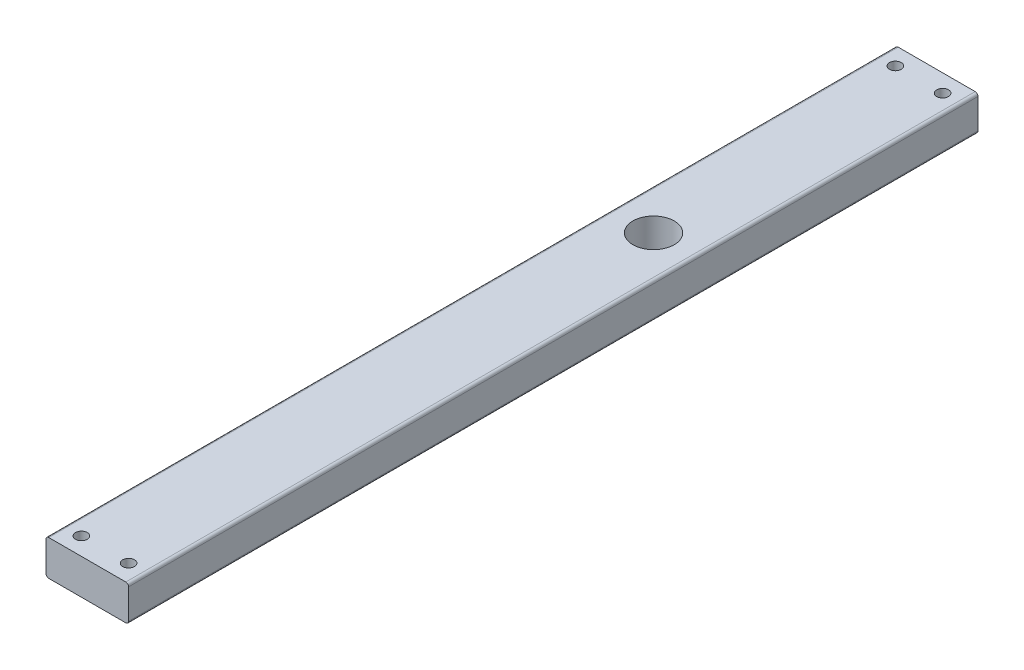
ISO-10303-21;
HEADER;
FILE_DESCRIPTION(('STEP AP214'),'2;1');
FILE_NAME('part.step','',(''),(''),'','','');
FILE_SCHEMA(('AUTOMOTIVE_DESIGN { 1 0 10303 214 1 1 1 1 }'));
ENDSEC;
DATA;
#1=APPLICATION_CONTEXT('core data for automotive mechanical design processes');
#2=APPLICATION_PROTOCOL_DEFINITION('international standard','automotive_design',2000,#1);
#3=PRODUCT_CONTEXT('',#1,'mechanical');
#4=PRODUCT('Part','Part','',(#3));
#5=PRODUCT_RELATED_PRODUCT_CATEGORY('part','',(#4));
#6=PRODUCT_DEFINITION_FORMATION('','',#4);
#7=PRODUCT_DEFINITION_CONTEXT('part definition',#1,'design');
#8=PRODUCT_DEFINITION('design','',#6,#7);
#9=PRODUCT_DEFINITION_SHAPE('','',#8);
#10=(LENGTH_UNIT() NAMED_UNIT(*) SI_UNIT(.MILLI.,.METRE.));
#11=(NAMED_UNIT(*) PLANE_ANGLE_UNIT() SI_UNIT($,.RADIAN.));
#12=(NAMED_UNIT(*) SI_UNIT($,.STERADIAN.) SOLID_ANGLE_UNIT());
#13=UNCERTAINTY_MEASURE_WITH_UNIT(LENGTH_MEASURE(1.E-05),#10,'distance_accuracy_value','');
#14=(GEOMETRIC_REPRESENTATION_CONTEXT(3) GLOBAL_UNCERTAINTY_ASSIGNED_CONTEXT((#13)) GLOBAL_UNIT_ASSIGNED_CONTEXT((#10,
#11,#12)) REPRESENTATION_CONTEXT('',''));
#15=CARTESIAN_POINT('',(0.,0.,0.));
#16=DIRECTION('',(0.,0.,1.));
#17=DIRECTION('',(1.,0.,0.));
#18=AXIS2_PLACEMENT_3D('',#15,#16,#17);
#19=CARTESIAN_POINT('',(41.45,19.05,914.4));
#20=DIRECTION('',(0.,-1.,0.));
#21=DIRECTION('',(1.,0.,0.));
#22=AXIS2_PLACEMENT_3D('',#19,#20,#21);
#23=PLANE('',#22);
#24=CARTESIAN_POINT('',(-25.4000000000001,19.05,895.35));
#25=DIRECTION('',(0.,1.,0.));
#26=DIRECTION('',(0.,0.,1.));
#27=AXIS2_PLACEMENT_3D('',#24,#25,#26);
#28=CIRCLE('',#27,6.35);
#29=CARTESIAN_POINT('',(-25.4000000000001,19.05,901.7));
#30=VERTEX_POINT('',#29);
#31=EDGE_CURVE('E248',#30,#30,#28,.T.);
#32=ORIENTED_EDGE('',*,*,#31,.F.);
#33=EDGE_LOOP('',(#32));
#34=FACE_BOUND('',#33,.T.);
#35=CARTESIAN_POINT('',(25.4000000000001,19.05,895.35));
#36=DIRECTION('',(0.,1.,0.));
#37=DIRECTION('',(0.,0.,1.));
#38=AXIS2_PLACEMENT_3D('',#35,#36,#37);
#39=CIRCLE('',#38,6.35);
#40=CARTESIAN_POINT('',(25.4000000000001,19.05,901.7));
#41=VERTEX_POINT('',#40);
#42=EDGE_CURVE('E240',#41,#41,#39,.T.);
#43=ORIENTED_EDGE('',*,*,#42,.F.);
#44=EDGE_LOOP('',(#43));
#45=FACE_BOUND('',#44,.T.);
#46=CARTESIAN_POINT('',(-25.4,19.05,19.05));
#47=DIRECTION('',(0.,1.,0.));
#48=DIRECTION('',(0.,0.,1.));
#49=AXIS2_PLACEMENT_3D('',#46,#47,#48);
#50=CIRCLE('',#49,6.35);
#51=CARTESIAN_POINT('',(-25.4,19.05,25.4));
#52=VERTEX_POINT('',#51);
#53=EDGE_CURVE('E232',#52,#52,#50,.T.);
#54=ORIENTED_EDGE('',*,*,#53,.F.);
#55=EDGE_LOOP('',(#54));
#56=FACE_BOUND('',#55,.T.);
#57=CARTESIAN_POINT('',(0.,19.05,304.8));
#58=DIRECTION('',(0.,1.,0.));
#59=DIRECTION('',(-1.,0.,0.));
#60=AXIS2_PLACEMENT_3D('',#57,#58,#59);
#61=CIRCLE('',#60,22.225);
#62=CARTESIAN_POINT('',(-22.225,19.05,304.8));
#63=VERTEX_POINT('',#62);
#64=EDGE_CURVE('E213',#63,#63,#61,.T.);
#65=ORIENTED_EDGE('',*,*,#64,.F.);
#66=EDGE_LOOP('',(#65));
#67=FACE_BOUND('',#66,.T.);
#68=DIRECTION('',(-1.,0.,0.));
#69=VECTOR('',#68,1.);
#70=CARTESIAN_POINT('',(41.45,19.05,0.));
#71=LINE('',#70,#69);
#72=CARTESIAN_POINT('',(41.45,19.05,0.));
#73=VERTEX_POINT('',#72);
#74=CARTESIAN_POINT('',(-41.45,19.05,0.));
#75=VERTEX_POINT('',#74);
#76=EDGE_CURVE('E133',#73,#75,#71,.T.);
#77=ORIENTED_EDGE('',*,*,#76,.T.);
#78=DIRECTION('',(0.,0.,-1.));
#79=VECTOR('',#78,1.);
#80=CARTESIAN_POINT('',(-41.45,19.05,914.4));
#81=LINE('',#80,#79);
#82=CARTESIAN_POINT('',(-41.45,19.05,914.4));
#83=VERTEX_POINT('',#82);
#84=EDGE_CURVE('E130',#83,#75,#81,.T.);
#85=ORIENTED_EDGE('',*,*,#84,.F.);
#86=DIRECTION('',(-1.,0.,0.));
#87=VECTOR('',#86,1.);
#88=CARTESIAN_POINT('',(41.45,19.05,914.4));
#89=LINE('',#88,#87);
#90=CARTESIAN_POINT('',(41.45,19.05,914.4));
#91=VERTEX_POINT('',#90);
#92=EDGE_CURVE('E118',#91,#83,#89,.T.);
#93=ORIENTED_EDGE('',*,*,#92,.F.);
#94=DIRECTION('',(0.,0.,-1.));
#95=VECTOR('',#94,1.);
#96=CARTESIAN_POINT('',(41.45,19.05,914.4));
#97=LINE('',#96,#95);
#98=EDGE_CURVE('E135',#91,#73,#97,.T.);
#99=ORIENTED_EDGE('',*,*,#98,.T.);
#100=EDGE_LOOP('',(#77,#85,#93,#99));
#101=FACE_BOUND('',#100,.T.);
#102=CARTESIAN_POINT('',(25.4,19.05,19.05));
#103=DIRECTION('',(0.,1.,0.));
#104=DIRECTION('',(0.,0.,1.));
#105=AXIS2_PLACEMENT_3D('',#102,#103,#104);
#106=CIRCLE('',#105,6.35);
#107=CARTESIAN_POINT('',(25.4,19.05,25.4));
#108=VERTEX_POINT('',#107);
#109=EDGE_CURVE('E224',#108,#108,#106,.T.);
#110=ORIENTED_EDGE('',*,*,#109,.F.);
#111=EDGE_LOOP('',(#110));
#112=FACE_BOUND('',#111,.T.);
#113=ADVANCED_FACE('F44',(#34,#45,#56,#67,#101,#112),#23,.F.);
#114=CARTESIAN_POINT('',(-41.45,-16.05,914.4));
#115=DIRECTION('',(0.,0.,-1.));
#116=DIRECTION('',(-1.,0.,0.));
#117=AXIS2_PLACEMENT_3D('',#114,#115,#116);
#118=CYLINDRICAL_SURFACE('',#117,3.);
#119=CARTESIAN_POINT('',(-41.45,-16.05,0.));
#120=DIRECTION('',(0.,0.,1.));
#121=DIRECTION('',(-1.,0.,0.));
#122=AXIS2_PLACEMENT_3D('',#119,#120,#121);
#123=CIRCLE('',#122,3.);
#124=CARTESIAN_POINT('',(-44.45,-16.05,0.));
#125=VERTEX_POINT('',#124);
#126=CARTESIAN_POINT('',(-41.45,-19.05,0.));
#127=VERTEX_POINT('',#126);
#128=EDGE_CURVE('E146',#125,#127,#123,.T.);
#129=ORIENTED_EDGE('',*,*,#128,.T.);
#130=DIRECTION('',(0.,0.,-1.));
#131=VECTOR('',#130,1.);
#132=CARTESIAN_POINT('',(-41.45,-19.05,914.4));
#133=LINE('',#132,#131);
#134=CARTESIAN_POINT('',(-41.45,-19.05,914.4));
#135=VERTEX_POINT('',#134);
#136=EDGE_CURVE('E11',#135,#127,#133,.T.);
#137=ORIENTED_EDGE('',*,*,#136,.F.);
#138=CARTESIAN_POINT('',(-41.45,-16.05,914.4));
#139=DIRECTION('',(0.,0.,1.));
#140=DIRECTION('',(-1.,0.,0.));
#141=AXIS2_PLACEMENT_3D('',#138,#139,#140);
#142=CIRCLE('',#141,3.);
#143=CARTESIAN_POINT('',(-44.45,-16.05,914.4));
#144=VERTEX_POINT('',#143);
#145=EDGE_CURVE('E169',#144,#135,#142,.T.);
#146=ORIENTED_EDGE('',*,*,#145,.F.);
#147=DIRECTION('',(0.,0.,-1.));
#148=VECTOR('',#147,1.);
#149=CARTESIAN_POINT('',(-44.45,-16.05,914.4));
#150=LINE('',#149,#148);
#151=EDGE_CURVE('E142',#144,#125,#150,.T.);
#152=ORIENTED_EDGE('',*,*,#151,.T.);
#153=EDGE_LOOP('',(#129,#137,#146,#152));
#154=FACE_BOUND('',#153,.T.);
#155=ADVANCED_FACE('F46',(#154),#118,.T.);
#156=CARTESIAN_POINT('',(41.45,-19.05,914.4));
#157=DIRECTION('',(0.,1.,0.));
#158=DIRECTION('',(-1.,0.,0.));
#159=AXIS2_PLACEMENT_3D('',#156,#157,#158);
#160=PLANE('',#159);
#161=CARTESIAN_POINT('',(-25.4000000000001,-19.05,895.35));
#162=DIRECTION('',(0.,1.,0.));
#163=DIRECTION('',(0.,0.,1.));
#164=AXIS2_PLACEMENT_3D('',#161,#162,#163);
#165=CIRCLE('',#164,6.34999999999999);
#166=CARTESIAN_POINT('',(-25.4000000000001,-19.05,901.7));
#167=VERTEX_POINT('',#166);
#168=EDGE_CURVE('E244',#167,#167,#165,.T.);
#169=ORIENTED_EDGE('',*,*,#168,.T.);
#170=EDGE_LOOP('',(#169));
#171=FACE_BOUND('',#170,.T.);
#172=CARTESIAN_POINT('',(25.4000000000001,-19.05,895.35));
#173=DIRECTION('',(0.,1.,0.));
#174=DIRECTION('',(0.,0.,1.));
#175=AXIS2_PLACEMENT_3D('',#172,#173,#174);
#176=CIRCLE('',#175,6.35);
#177=CARTESIAN_POINT('',(25.4000000000001,-19.05,901.7));
#178=VERTEX_POINT('',#177);
#179=EDGE_CURVE('E236',#178,#178,#176,.T.);
#180=ORIENTED_EDGE('',*,*,#179,.T.);
#181=EDGE_LOOP('',(#180));
#182=FACE_BOUND('',#181,.T.);
#183=CARTESIAN_POINT('',(-25.4,-19.05,19.05));
#184=DIRECTION('',(0.,1.,0.));
#185=DIRECTION('',(0.,0.,1.));
#186=AXIS2_PLACEMENT_3D('',#183,#184,#185);
#187=CIRCLE('',#186,6.34999999999999);
#188=CARTESIAN_POINT('',(-25.4,-19.05,25.4));
#189=VERTEX_POINT('',#188);
#190=EDGE_CURVE('E228',#189,#189,#187,.T.);
#191=ORIENTED_EDGE('',*,*,#190,.T.);
#192=EDGE_LOOP('',(#191));
#193=FACE_BOUND('',#192,.T.);
#194=CARTESIAN_POINT('',(25.4,-19.05,19.05));
#195=DIRECTION('',(0.,1.,0.));
#196=DIRECTION('',(0.,0.,1.));
#197=AXIS2_PLACEMENT_3D('',#194,#195,#196);
#198=CIRCLE('',#197,6.35);
#199=CARTESIAN_POINT('',(25.4,-19.05,25.4));
#200=VERTEX_POINT('',#199);
#201=EDGE_CURVE('E217',#200,#200,#198,.T.);
#202=ORIENTED_EDGE('',*,*,#201,.T.);
#203=EDGE_LOOP('',(#202));
#204=FACE_BOUND('',#203,.T.);
#205=CARTESIAN_POINT('',(0.,-19.05,304.8));
#206=DIRECTION('',(0.,1.,0.));
#207=DIRECTION('',(-1.,0.,0.));
#208=AXIS2_PLACEMENT_3D('',#205,#206,#207);
#209=CIRCLE('',#208,22.225);
#210=CARTESIAN_POINT('',(-22.225,-19.05,304.8));
#211=VERTEX_POINT('',#210);
#212=EDGE_CURVE('E151',#211,#211,#209,.T.);
#213=ORIENTED_EDGE('',*,*,#212,.T.);
#214=EDGE_LOOP('',(#213));
#215=FACE_BOUND('',#214,.T.);
#216=DIRECTION('',(1.,0.,0.));
#217=VECTOR('',#216,1.);
#218=CARTESIAN_POINT('',(41.45,-19.05,0.));
#219=LINE('',#218,#217);
#220=CARTESIAN_POINT('',(41.45,-19.05,0.));
#221=VERTEX_POINT('',#220);
#222=EDGE_CURVE('E150',#127,#221,#219,.T.);
#223=ORIENTED_EDGE('',*,*,#222,.T.);
#224=DIRECTION('',(0.,0.,-1.));
#225=VECTOR('',#224,1.);
#226=CARTESIAN_POINT('',(41.45,-19.05,914.4));
#227=LINE('',#226,#225);
#228=CARTESIAN_POINT('',(41.45,-19.05,914.4));
#229=VERTEX_POINT('',#228);
#230=EDGE_CURVE('E54',#229,#221,#227,.T.);
#231=ORIENTED_EDGE('',*,*,#230,.F.);
#232=DIRECTION('',(1.,0.,0.));
#233=VECTOR('',#232,1.);
#234=CARTESIAN_POINT('',(41.45,-19.05,914.4));
#235=LINE('',#234,#233);
#236=EDGE_CURVE('E105',#135,#229,#235,.T.);
#237=ORIENTED_EDGE('',*,*,#236,.F.);
#238=ORIENTED_EDGE('',*,*,#136,.T.);
#239=EDGE_LOOP('',(#223,#231,#237,#238));
#240=FACE_BOUND('',#239,.T.);
#241=ADVANCED_FACE('F292',(#171,#182,#193,#204,#215,#240),#160,.F.);
#242=CARTESIAN_POINT('',(41.45,-16.05,914.4));
#243=DIRECTION('',(0.,0.,-1.));
#244=DIRECTION('',(-1.,0.,0.));
#245=AXIS2_PLACEMENT_3D('',#242,#243,#244);
#246=CYLINDRICAL_SURFACE('',#245,3.);
#247=CARTESIAN_POINT('',(41.45,-16.05,0.));
#248=DIRECTION('',(0.,0.,1.));
#249=DIRECTION('',(1.,0.,0.));
#250=AXIS2_PLACEMENT_3D('',#247,#248,#249);
#251=CIRCLE('',#250,3.);
#252=CARTESIAN_POINT('',(44.45,-16.05,0.));
#253=VERTEX_POINT('',#252);
#254=EDGE_CURVE('E154',#221,#253,#251,.T.);
#255=ORIENTED_EDGE('',*,*,#254,.T.);
#256=DIRECTION('',(0.,0.,-1.));
#257=VECTOR('',#256,1.);
#258=CARTESIAN_POINT('',(44.45,-16.05,914.4));
#259=LINE('',#258,#257);
#260=CARTESIAN_POINT('',(44.45,-16.05,914.4));
#261=VERTEX_POINT('',#260);
#262=EDGE_CURVE('E180',#261,#253,#259,.T.);
#263=ORIENTED_EDGE('',*,*,#262,.F.);
#264=CARTESIAN_POINT('',(41.45,-16.05,914.4));
#265=DIRECTION('',(0.,0.,1.));
#266=DIRECTION('',(1.,0.,0.));
#267=AXIS2_PLACEMENT_3D('',#264,#265,#266);
#268=CIRCLE('',#267,3.);
#269=EDGE_CURVE('E190',#229,#261,#268,.T.);
#270=ORIENTED_EDGE('',*,*,#269,.F.);
#271=ORIENTED_EDGE('',*,*,#230,.T.);
#272=EDGE_LOOP('',(#255,#263,#270,#271));
#273=FACE_BOUND('',#272,.T.);
#274=ADVANCED_FACE('F188',(#273),#246,.T.);
#275=CARTESIAN_POINT('',(44.45,-16.05,914.4));
#276=DIRECTION('',(-1.,0.,0.));
#277=DIRECTION('',(0.,0.,1.));
#278=AXIS2_PLACEMENT_3D('',#275,#276,#277);
#279=PLANE('',#278);
#280=DIRECTION('',(0.,1.,0.));
#281=VECTOR('',#280,1.);
#282=CARTESIAN_POINT('',(44.45,-16.05,0.));
#283=LINE('',#282,#281);
#284=CARTESIAN_POINT('',(44.45,16.05,0.));
#285=VERTEX_POINT('',#284);
#286=EDGE_CURVE('E157',#253,#285,#283,.T.);
#287=ORIENTED_EDGE('',*,*,#286,.T.);
#288=DIRECTION('',(0.,0.,-1.));
#289=VECTOR('',#288,1.);
#290=CARTESIAN_POINT('',(44.45,16.05,914.4));
#291=LINE('',#290,#289);
#292=CARTESIAN_POINT('',(44.45,16.05,914.4));
#293=VERTEX_POINT('',#292);
#294=EDGE_CURVE('E176',#293,#285,#291,.T.);
#295=ORIENTED_EDGE('',*,*,#294,.F.);
#296=DIRECTION('',(0.,1.,0.));
#297=VECTOR('',#296,1.);
#298=CARTESIAN_POINT('',(44.45,-16.05,914.4));
#299=LINE('',#298,#297);
#300=EDGE_CURVE('E203',#261,#293,#299,.T.);
#301=ORIENTED_EDGE('',*,*,#300,.F.);
#302=ORIENTED_EDGE('',*,*,#262,.T.);
#303=EDGE_LOOP('',(#287,#295,#301,#302));
#304=FACE_BOUND('',#303,.T.);
#305=ADVANCED_FACE('F198',(#304),#279,.F.);
#306=CARTESIAN_POINT('',(41.45,16.05,914.4));
#307=DIRECTION('',(0.,0.,-1.));
#308=DIRECTION('',(-1.,0.,0.));
#309=AXIS2_PLACEMENT_3D('',#306,#307,#308);
#310=CYLINDRICAL_SURFACE('',#309,3.);
#311=CARTESIAN_POINT('',(41.45,16.05,0.));
#312=DIRECTION('',(0.,0.,1.));
#313=DIRECTION('',(1.,0.,0.));
#314=AXIS2_PLACEMENT_3D('',#311,#312,#313);
#315=CIRCLE('',#314,3.);
#316=EDGE_CURVE('E160',#285,#73,#315,.T.);
#317=ORIENTED_EDGE('',*,*,#316,.T.);
#318=ORIENTED_EDGE('',*,*,#98,.F.);
#319=CARTESIAN_POINT('',(41.45,16.05,914.4));
#320=DIRECTION('',(0.,0.,1.));
#321=DIRECTION('',(1.,0.,0.));
#322=AXIS2_PLACEMENT_3D('',#319,#320,#321);
#323=CIRCLE('',#322,3.);
#324=EDGE_CURVE('E124',#293,#91,#323,.T.);
#325=ORIENTED_EDGE('',*,*,#324,.F.);
#326=ORIENTED_EDGE('',*,*,#294,.T.);
#327=EDGE_LOOP('',(#317,#318,#325,#326));
#328=FACE_BOUND('',#327,.T.);
#329=ADVANCED_FACE('F201',(#328),#310,.T.);
#330=CARTESIAN_POINT('',(-41.45,16.05,914.4));
#331=DIRECTION('',(0.,0.,-1.));
#332=DIRECTION('',(-1.,0.,0.));
#333=AXIS2_PLACEMENT_3D('',#330,#331,#332);
#334=CYLINDRICAL_SURFACE('',#333,3.);
#335=CARTESIAN_POINT('',(-41.45,16.05,0.));
#336=DIRECTION('',(0.,0.,1.));
#337=DIRECTION('',(1.,0.,0.));
#338=AXIS2_PLACEMENT_3D('',#335,#336,#337);
#339=CIRCLE('',#338,3.);
#340=CARTESIAN_POINT('',(-44.45,16.05,0.));
#341=VERTEX_POINT('',#340);
#342=EDGE_CURVE('E91',#75,#341,#339,.T.);
#343=ORIENTED_EDGE('',*,*,#342,.T.);
#344=DIRECTION('',(0.,0.,-1.));
#345=VECTOR('',#344,1.);
#346=CARTESIAN_POINT('',(-44.45,16.05,914.4));
#347=LINE('',#346,#345);
#348=CARTESIAN_POINT('',(-44.45,16.05,914.4));
#349=VERTEX_POINT('',#348);
#350=EDGE_CURVE('E136',#349,#341,#347,.T.);
#351=ORIENTED_EDGE('',*,*,#350,.F.);
#352=CARTESIAN_POINT('',(-41.45,16.05,914.4));
#353=DIRECTION('',(0.,0.,1.));
#354=DIRECTION('',(1.,0.,0.));
#355=AXIS2_PLACEMENT_3D('',#352,#353,#354);
#356=CIRCLE('',#355,3.);
#357=EDGE_CURVE('E122',#83,#349,#356,.T.);
#358=ORIENTED_EDGE('',*,*,#357,.F.);
#359=ORIENTED_EDGE('',*,*,#84,.T.);
#360=EDGE_LOOP('',(#343,#351,#358,#359));
#361=FACE_BOUND('',#360,.T.);
#362=ADVANCED_FACE('F138',(#361),#334,.T.);
#363=CARTESIAN_POINT('',(-44.45,-16.05,914.4));
#364=DIRECTION('',(1.,0.,0.));
#365=DIRECTION('',(0.,0.,-1.));
#366=AXIS2_PLACEMENT_3D('',#363,#364,#365);
#367=PLANE('',#366);
#368=DIRECTION('',(0.,-1.,0.));
#369=VECTOR('',#368,1.);
#370=CARTESIAN_POINT('',(-44.45,-16.05,0.));
#371=LINE('',#370,#369);
#372=EDGE_CURVE('E97',#341,#125,#371,.T.);
#373=ORIENTED_EDGE('',*,*,#372,.T.);
#374=ORIENTED_EDGE('',*,*,#151,.F.);
#375=DIRECTION('',(0.,-1.,0.));
#376=VECTOR('',#375,1.);
#377=CARTESIAN_POINT('',(-44.45,-16.05,914.4));
#378=LINE('',#377,#376);
#379=EDGE_CURVE('E62',#349,#144,#378,.T.);
#380=ORIENTED_EDGE('',*,*,#379,.F.);
#381=ORIENTED_EDGE('',*,*,#350,.T.);
#382=EDGE_LOOP('',(#373,#374,#380,#381));
#383=FACE_BOUND('',#382,.T.);
#384=ADVANCED_FACE('F281',(#383),#367,.F.);
#385=CARTESIAN_POINT('',(-41.45,-16.05,914.4));
#386=DIRECTION('',(0.,0.,-1.));
#387=DIRECTION('',(-1.,0.,0.));
#388=AXIS2_PLACEMENT_3D('',#385,#386,#387);
#389=PLANE('',#388);
#390=ORIENTED_EDGE('',*,*,#145,.T.);
#391=ORIENTED_EDGE('',*,*,#236,.T.);
#392=ORIENTED_EDGE('',*,*,#269,.T.);
#393=ORIENTED_EDGE('',*,*,#300,.T.);
#394=ORIENTED_EDGE('',*,*,#324,.T.);
#395=ORIENTED_EDGE('',*,*,#92,.T.);
#396=ORIENTED_EDGE('',*,*,#357,.T.);
#397=ORIENTED_EDGE('',*,*,#379,.T.);
#398=EDGE_LOOP('',(#390,#391,#392,#393,#394,#395,#396,#397));
#399=FACE_BOUND('',#398,.T.);
#400=ADVANCED_FACE('F120',(#399),#389,.F.);
#401=CARTESIAN_POINT('',(-41.45,-16.05,0.));
#402=DIRECTION('',(0.,0.,-1.));
#403=DIRECTION('',(-1.,0.,0.));
#404=AXIS2_PLACEMENT_3D('',#401,#402,#403);
#405=PLANE('',#404);
#406=ORIENTED_EDGE('',*,*,#128,.F.);
#407=ORIENTED_EDGE('',*,*,#372,.F.);
#408=ORIENTED_EDGE('',*,*,#342,.F.);
#409=ORIENTED_EDGE('',*,*,#76,.F.);
#410=ORIENTED_EDGE('',*,*,#316,.F.);
#411=ORIENTED_EDGE('',*,*,#286,.F.);
#412=ORIENTED_EDGE('',*,*,#254,.F.);
#413=ORIENTED_EDGE('',*,*,#222,.F.);
#414=EDGE_LOOP('',(#406,#407,#408,#409,#410,#411,#412,#413));
#415=FACE_BOUND('',#414,.T.);
#416=ADVANCED_FACE('F194',(#415),#405,.T.);
#417=CARTESIAN_POINT('',(0.,-19.05,304.8));
#418=DIRECTION('',(0.,1.,0.));
#419=DIRECTION('',(-1.,0.,0.));
#420=AXIS2_PLACEMENT_3D('',#417,#418,#419);
#421=CYLINDRICAL_SURFACE('',#420,22.225);
#422=ORIENTED_EDGE('',*,*,#212,.F.);
#423=EDGE_LOOP('',(#422));
#424=FACE_BOUND('',#423,.T.);
#425=ORIENTED_EDGE('',*,*,#64,.T.);
#426=EDGE_LOOP('',(#425));
#427=FACE_BOUND('',#426,.T.);
#428=ADVANCED_FACE('F264',(#424,#427),#421,.F.);
#429=CARTESIAN_POINT('',(25.4,19.05,19.05));
#430=DIRECTION('',(0.,1.,0.));
#431=DIRECTION('',(0.,0.,1.));
#432=AXIS2_PLACEMENT_3D('',#429,#430,#431);
#433=CYLINDRICAL_SURFACE('',#432,6.35);
#434=ORIENTED_EDGE('',*,*,#201,.F.);
#435=EDGE_LOOP('',(#434));
#436=FACE_BOUND('',#435,.T.);
#437=ORIENTED_EDGE('',*,*,#109,.T.);
#438=EDGE_LOOP('',(#437));
#439=FACE_BOUND('',#438,.T.);
#440=ADVANCED_FACE('F266',(#436,#439),#433,.F.);
#441=CARTESIAN_POINT('',(-25.4,19.05,19.05));
#442=DIRECTION('',(0.,1.,0.));
#443=DIRECTION('',(0.,0.,1.));
#444=AXIS2_PLACEMENT_3D('',#441,#442,#443);
#445=CYLINDRICAL_SURFACE('',#444,6.35);
#446=ORIENTED_EDGE('',*,*,#190,.F.);
#447=EDGE_LOOP('',(#446));
#448=FACE_BOUND('',#447,.T.);
#449=ORIENTED_EDGE('',*,*,#53,.T.);
#450=EDGE_LOOP('',(#449));
#451=FACE_BOUND('',#450,.T.);
#452=ADVANCED_FACE('F273',(#448,#451),#445,.F.);
#453=CARTESIAN_POINT('',(25.4000000000001,19.05,895.35));
#454=DIRECTION('',(0.,1.,0.));
#455=DIRECTION('',(0.,0.,1.));
#456=AXIS2_PLACEMENT_3D('',#453,#454,#455);
#457=CYLINDRICAL_SURFACE('',#456,6.35);
#458=ORIENTED_EDGE('',*,*,#179,.F.);
#459=EDGE_LOOP('',(#458));
#460=FACE_BOUND('',#459,.T.);
#461=ORIENTED_EDGE('',*,*,#42,.T.);
#462=EDGE_LOOP('',(#461));
#463=FACE_BOUND('',#462,.T.);
#464=ADVANCED_FACE('F314',(#460,#463),#457,.F.);
#465=CARTESIAN_POINT('',(-25.4000000000001,19.05,895.35));
#466=DIRECTION('',(0.,1.,0.));
#467=DIRECTION('',(0.,0.,1.));
#468=AXIS2_PLACEMENT_3D('',#465,#466,#467);
#469=CYLINDRICAL_SURFACE('',#468,6.35);
#470=ORIENTED_EDGE('',*,*,#168,.F.);
#471=EDGE_LOOP('',(#470));
#472=FACE_BOUND('',#471,.T.);
#473=ORIENTED_EDGE('',*,*,#31,.T.);
#474=EDGE_LOOP('',(#473));
#475=FACE_BOUND('',#474,.T.);
#476=ADVANCED_FACE('F253',(#472,#475),#469,.F.);
#477=CLOSED_SHELL('',(#113,#155,#241,#274,#305,#329,#362,#384,#400,#416,#428,#440,#452,#464,#476));
#478=MANIFOLD_SOLID_BREP('B2',#477);
#479=ADVANCED_BREP_SHAPE_REPRESENTATION('',(#18,#478),#14);
#480=SHAPE_DEFINITION_REPRESENTATION(#9,#479);
ENDSEC;
END-ISO-10303-21;
